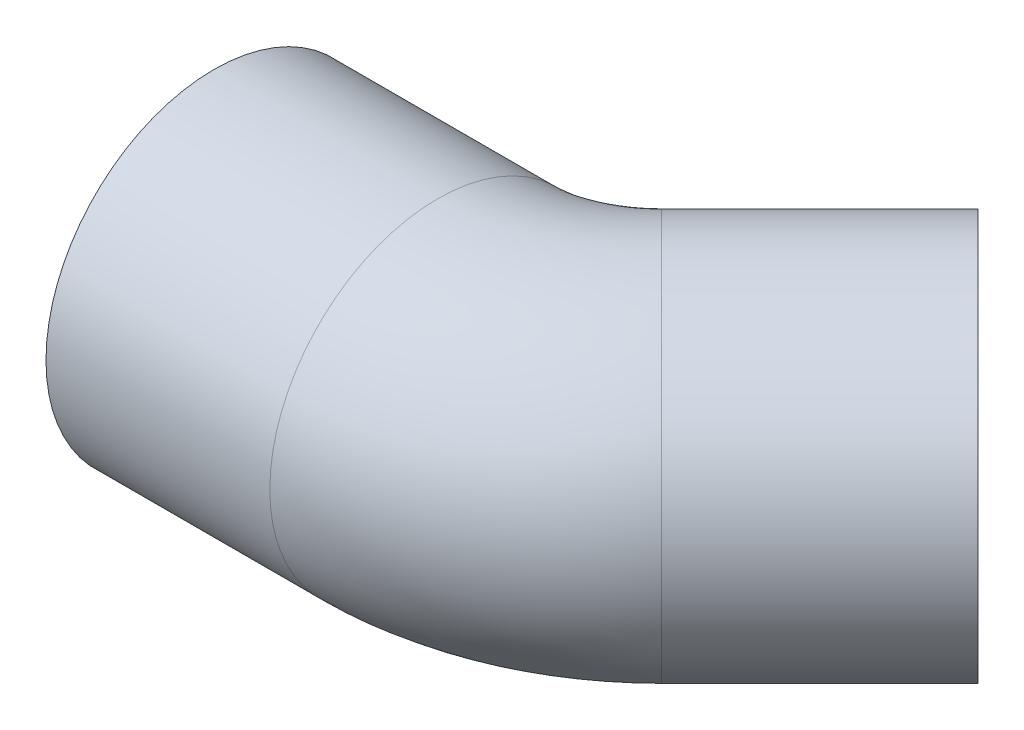
ISO-10303-21;
HEADER;
FILE_DESCRIPTION(('STEP AP214'),'2;1');
FILE_NAME('part.step','',(''),(''),'','','');
FILE_SCHEMA(('AUTOMOTIVE_DESIGN { 1 0 10303 214 1 1 1 1 }'));
ENDSEC;
DATA;
#1=APPLICATION_CONTEXT('core data for automotive mechanical design processes');
#2=APPLICATION_PROTOCOL_DEFINITION('international standard','automotive_design',2000,#1);
#3=PRODUCT_CONTEXT('',#1,'mechanical');
#4=PRODUCT('Part','Part','',(#3));
#5=PRODUCT_RELATED_PRODUCT_CATEGORY('part','',(#4));
#6=PRODUCT_DEFINITION_FORMATION('','',#4);
#7=PRODUCT_DEFINITION_CONTEXT('part definition',#1,'design');
#8=PRODUCT_DEFINITION('design','',#6,#7);
#9=PRODUCT_DEFINITION_SHAPE('','',#8);
#10=(LENGTH_UNIT() NAMED_UNIT(*) SI_UNIT(.MILLI.,.METRE.));
#11=(NAMED_UNIT(*) PLANE_ANGLE_UNIT() SI_UNIT($,.RADIAN.));
#12=(NAMED_UNIT(*) SI_UNIT($,.STERADIAN.) SOLID_ANGLE_UNIT());
#13=UNCERTAINTY_MEASURE_WITH_UNIT(LENGTH_MEASURE(1.E-05),#10,'distance_accuracy_value','');
#14=(GEOMETRIC_REPRESENTATION_CONTEXT(3) GLOBAL_UNCERTAINTY_ASSIGNED_CONTEXT((#13)) GLOBAL_UNIT_ASSIGNED_CONTEXT((#10,
#11,#12)) REPRESENTATION_CONTEXT('',''));
#15=CARTESIAN_POINT('',(0.,0.,0.));
#16=DIRECTION('',(0.,0.,1.));
#17=DIRECTION('',(1.,0.,0.));
#18=AXIS2_PLACEMENT_3D('',#15,#16,#17);
#19=CARTESIAN_POINT('',(0.,0.,0.));
#20=DIRECTION('',(1.,0.,0.));
#21=DIRECTION('',(0.,0.,-1.));
#22=AXIS2_PLACEMENT_3D('',#19,#20,#21);
#23=PLANE('',#22);
#24=CARTESIAN_POINT('',(0.,0.,0.));
#25=DIRECTION('',(1.,0.,0.));
#26=DIRECTION('',(0.,0.,-1.));
#27=AXIS2_PLACEMENT_3D('',#24,#25,#26);
#28=CIRCLE('',#27,9.525);
#29=CARTESIAN_POINT('',(0.,0.,-9.525));
#30=VERTEX_POINT('',#29);
#31=EDGE_CURVE('E54',#30,#30,#28,.T.);
#32=ORIENTED_EDGE('',*,*,#31,.F.);
#33=EDGE_LOOP('',(#32));
#34=FACE_BOUND('',#33,.T.);
#35=ADVANCED_FACE('F37',(#34),#23,.F.);
#36=CARTESIAN_POINT('',(30.6605122421383,0.,-12.7));
#37=DIRECTION('',(0.707106781186546,0.,-0.707106781186549));
#38=DIRECTION('',(-0.707106781186549,0.,-0.707106781186546));
#39=AXIS2_PLACEMENT_3D('',#36,#37,#38);
#40=PLANE('',#39);
#41=CARTESIAN_POINT('',(30.6605122421383,0.,-12.7));
#42=DIRECTION('',(0.707106781186546,0.,-0.707106781186549));
#43=DIRECTION('',(-0.707106781186549,0.,-0.707106781186546));
#44=AXIS2_PLACEMENT_3D('',#41,#42,#43);
#45=CIRCLE('',#44,9.525);
#46=CARTESIAN_POINT('',(23.9253201513364,0.,-19.4351920908019));
#47=VERTEX_POINT('',#46);
#48=EDGE_CURVE('E10',#47,#47,#45,.T.);
#49=ORIENTED_EDGE('',*,*,#48,.T.);
#50=EDGE_LOOP('',(#49));
#51=FACE_BOUND('',#50,.T.);
#52=ADVANCED_FACE('F64',(#51),#40,.T.);
#53=CARTESIAN_POINT('',(0.,0.,0.));
#54=DIRECTION('',(1.,0.,0.));
#55=DIRECTION('',(0.,0.,-1.));
#56=AXIS2_PLACEMENT_3D('',#53,#54,#55);
#57=CYLINDRICAL_SURFACE('',#56,9.525);
#58=CARTESIAN_POINT('',(12.7,0.,0.));
#59=DIRECTION('',(1.,0.,0.));
#60=DIRECTION('',(0.,0.,-1.));
#61=AXIS2_PLACEMENT_3D('',#58,#59,#60);
#62=CIRCLE('',#61,9.525);
#63=CARTESIAN_POINT('',(12.7,0.,9.525));
#64=VERTEX_POINT('',#63);
#65=EDGE_CURVE('E49',#64,#64,#62,.T.);
#66=ORIENTED_EDGE('',*,*,#65,.F.);
#67=EDGE_LOOP('',(#66));
#68=FACE_BOUND('',#67,.T.);
#69=ORIENTED_EDGE('',*,*,#31,.T.);
#70=EDGE_LOOP('',(#69));
#71=FACE_BOUND('',#70,.T.);
#72=ADVANCED_FACE('F61',(#68,#71),#57,.T.);
#73=CARTESIAN_POINT('',(12.7,0.,-12.7));
#74=DIRECTION('',(0.,1.,0.));
#75=DIRECTION('',(0.,0.,1.));
#76=AXIS2_PLACEMENT_3D('',#73,#74,#75);
#77=TOROIDAL_SURFACE('',#76,12.7,9.525);
#78=CARTESIAN_POINT('',(21.6802561210692,0.,-3.71974387893086));
#79=DIRECTION('',(0.707106781186546,0.,-0.707106781186549));
#80=DIRECTION('',(-0.707106781186549,0.,-0.707106781186546));
#81=AXIS2_PLACEMENT_3D('',#78,#79,#80);
#82=CIRCLE('',#81,9.525);
#83=CARTESIAN_POINT('',(28.4154482118711,0.,3.01544821187099));
#84=VERTEX_POINT('',#83);
#85=EDGE_CURVE('E44',#84,#84,#82,.T.);
#86=CARTESIAN_POINT('',(12.7,0.,-12.7));
#87=DIRECTION('',(0.,1.,0.));
#88=DIRECTION('',(0.,0.,1.));
#89=AXIS2_PLACEMENT_3D('',#86,#87,#88);
#90=CIRCLE('',#89,22.225);
#91=EDGE_CURVE('',#64,#84,#90,.T.);
#92=ORIENTED_EDGE('',*,*,#65,.T.);
#93=ORIENTED_EDGE('',*,*,#85,.F.);
#94=ORIENTED_EDGE('',*,*,#91,.T.);
#95=ORIENTED_EDGE('',*,*,#91,.F.);
#96=EDGE_LOOP('',(#92,#94,#93,#95));
#97=FACE_BOUND('',#96,.T.);
#98=ADVANCED_FACE('F70',(#97),#77,.T.);
#99=CARTESIAN_POINT('',(21.6802561210692,0.,-3.71974387893086));
#100=DIRECTION('',(0.707106781186546,0.,-0.707106781186549));
#101=DIRECTION('',(-0.707106781186549,0.,-0.707106781186546));
#102=AXIS2_PLACEMENT_3D('',#99,#100,#101);
#103=CYLINDRICAL_SURFACE('',#102,9.525);
#104=ORIENTED_EDGE('',*,*,#48,.F.);
#105=EDGE_LOOP('',(#104));
#106=FACE_BOUND('',#105,.T.);
#107=ORIENTED_EDGE('',*,*,#85,.T.);
#108=EDGE_LOOP('',(#107));
#109=FACE_BOUND('',#108,.T.);
#110=ADVANCED_FACE('F68',(#106,#109),#103,.T.);
#111=CLOSED_SHELL('',(#35,#52,#72,#98,#110));
#112=MANIFOLD_SOLID_BREP('B2',#111);
#113=ADVANCED_BREP_SHAPE_REPRESENTATION('',(#18,#112),#14);
#114=SHAPE_DEFINITION_REPRESENTATION(#9,#113);
ENDSEC;
END-ISO-10303-21;
